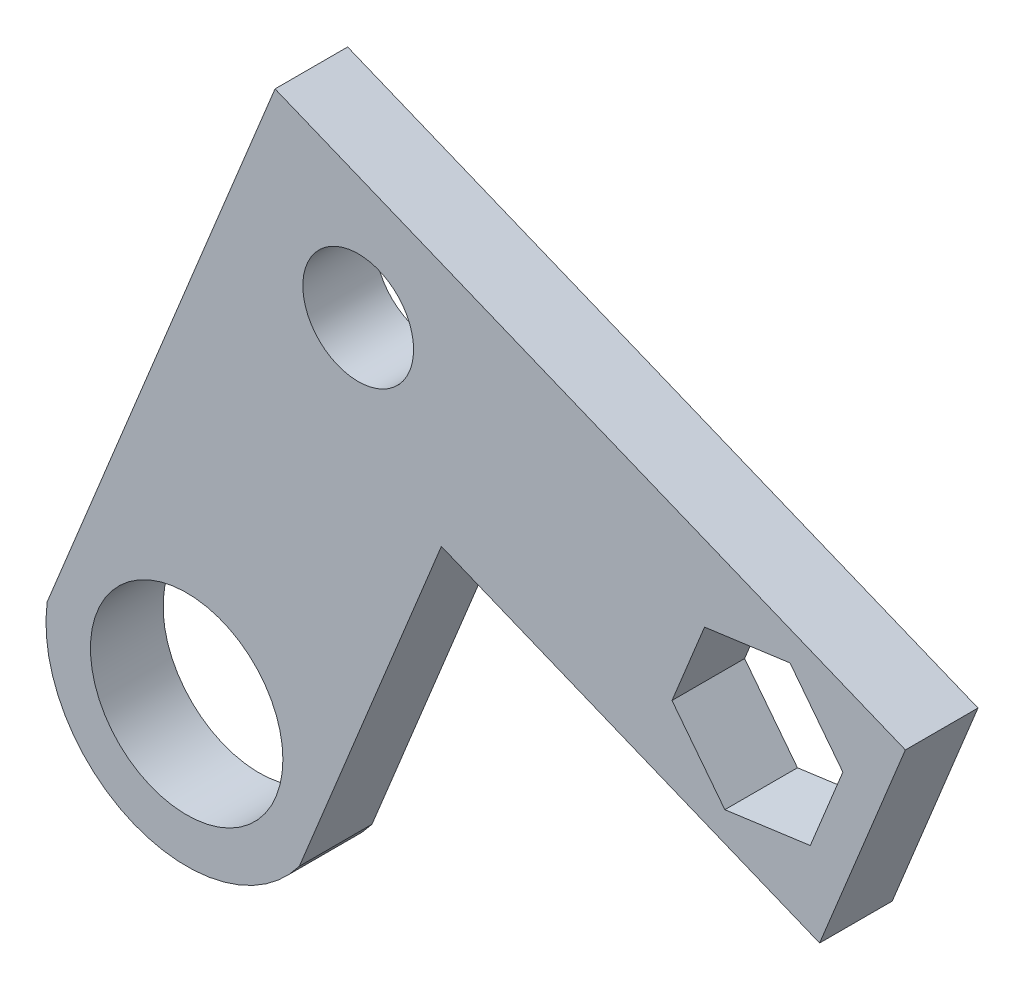
ISO-10303-21;
HEADER;
FILE_DESCRIPTION(('STEP AP214'),'2;1');
FILE_NAME('part.step','',(''),(''),'','','');
FILE_SCHEMA(('AUTOMOTIVE_DESIGN { 1 0 10303 214 1 1 1 1 }'));
ENDSEC;
DATA;
#1=APPLICATION_CONTEXT('core data for automotive mechanical design processes');
#2=APPLICATION_PROTOCOL_DEFINITION('international standard','automotive_design',2000,#1);
#3=PRODUCT_CONTEXT('',#1,'mechanical');
#4=PRODUCT('Part','Part','',(#3));
#5=PRODUCT_RELATED_PRODUCT_CATEGORY('part','',(#4));
#6=PRODUCT_DEFINITION_FORMATION('','',#4);
#7=PRODUCT_DEFINITION_CONTEXT('part definition',#1,'design');
#8=PRODUCT_DEFINITION('design','',#6,#7);
#9=PRODUCT_DEFINITION_SHAPE('','',#8);
#10=(LENGTH_UNIT() NAMED_UNIT(*) SI_UNIT(.MILLI.,.METRE.));
#11=(NAMED_UNIT(*) PLANE_ANGLE_UNIT() SI_UNIT($,.RADIAN.));
#12=(NAMED_UNIT(*) SI_UNIT($,.STERADIAN.) SOLID_ANGLE_UNIT());
#13=UNCERTAINTY_MEASURE_WITH_UNIT(LENGTH_MEASURE(1.E-05),#10,'distance_accuracy_value','');
#14=(GEOMETRIC_REPRESENTATION_CONTEXT(3) GLOBAL_UNCERTAINTY_ASSIGNED_CONTEXT((#13)) GLOBAL_UNIT_ASSIGNED_CONTEXT((#10,
#11,#12)) REPRESENTATION_CONTEXT('',''));
#15=CARTESIAN_POINT('',(0.,0.,0.));
#16=DIRECTION('',(0.,0.,1.));
#17=DIRECTION('',(1.,0.,0.));
#18=AXIS2_PLACEMENT_3D('',#15,#16,#17);
#19=CARTESIAN_POINT('',(-67.7805192720799,-46.4934408049665,-8.));
#20=DIRECTION('',(-0.925838313972113,0.377919854441752,0.));
#21=DIRECTION('',(-0.377919854441752,-0.925838313972113,0.));
#22=AXIS2_PLACEMENT_3D('',#19,#20,#21);
#23=PLANE('',#22);
#24=DIRECTION('',(-0.377919854441752,-0.925838313972113,0.));
#25=VECTOR('',#24,1.);
#26=CARTESIAN_POINT('',(-67.7805192720799,-46.4934408049665,0.));
#27=LINE('',#26,#25);
#28=CARTESIAN_POINT('',(-42.6847041591342,14.9869680141119,0.));
#29=VERTEX_POINT('',#28);
#30=CARTESIAN_POINT('',(-67.7805192720799,-46.4934408049665,0.));
#31=VERTEX_POINT('',#30);
#32=EDGE_CURVE('E184',#29,#31,#27,.T.);
#33=ORIENTED_EDGE('',*,*,#32,.F.);
#34=DIRECTION('',(0.,0.,1.));
#35=VECTOR('',#34,1.);
#36=CARTESIAN_POINT('',(-42.6847041591342,14.9869680141119,-8.));
#37=LINE('',#36,#35);
#38=CARTESIAN_POINT('',(-42.6847041591342,14.9869680141119,-8.));
#39=VERTEX_POINT('',#38);
#40=EDGE_CURVE('E11',#39,#29,#37,.T.);
#41=ORIENTED_EDGE('',*,*,#40,.F.);
#42=DIRECTION('',(-0.377919854441752,-0.925838313972113,0.));
#43=VECTOR('',#42,1.);
#44=CARTESIAN_POINT('',(-67.7805192720799,-46.4934408049665,-8.));
#45=LINE('',#44,#43);
#46=CARTESIAN_POINT('',(-67.7805192720799,-46.4934408049665,-8.));
#47=VERTEX_POINT('',#46);
#48=EDGE_CURVE('E187',#39,#47,#45,.T.);
#49=ORIENTED_EDGE('',*,*,#48,.T.);
#50=DIRECTION('',(0.,0.,1.));
#51=VECTOR('',#50,1.);
#52=CARTESIAN_POINT('',(-67.7805192720799,-46.4934408049665,-8.));
#53=LINE('',#52,#51);
#54=EDGE_CURVE('E36',#47,#31,#53,.T.);
#55=ORIENTED_EDGE('',*,*,#54,.T.);
#56=EDGE_LOOP('',(#33,#41,#49,#55));
#57=FACE_BOUND('',#56,.T.);
#58=ADVANCED_FACE('F33',(#57),#23,.T.);
#59=CARTESIAN_POINT('',(-42.6847041591342,14.9869680141119,-8.));
#60=DIRECTION('',(0.377919854441752,0.925838313972113,0.));
#61=DIRECTION('',(-0.925838313972113,0.377919854441752,0.));
#62=AXIS2_PLACEMENT_3D('',#59,#60,#61);
#63=PLANE('',#62);
#64=DIRECTION('',(-0.925838313972113,0.377919854441752,0.));
#65=VECTOR('',#64,1.);
#66=CARTESIAN_POINT('',(-42.6847041591342,14.9869680141119,0.));
#67=LINE('',#66,#65);
#68=CARTESIAN_POINT('',(26.7531693887742,-13.3570210690196,0.));
#69=VERTEX_POINT('',#68);
#70=EDGE_CURVE('E191',#69,#29,#67,.T.);
#71=ORIENTED_EDGE('',*,*,#70,.F.);
#72=DIRECTION('',(0.,0.,1.));
#73=VECTOR('',#72,1.);
#74=CARTESIAN_POINT('',(26.7531693887742,-13.3570210690196,-8.));
#75=LINE('',#74,#73);
#76=CARTESIAN_POINT('',(26.7531693887742,-13.3570210690196,-8.));
#77=VERTEX_POINT('',#76);
#78=EDGE_CURVE('E41',#77,#69,#75,.T.);
#79=ORIENTED_EDGE('',*,*,#78,.F.);
#80=DIRECTION('',(-0.925838313972113,0.377919854441752,0.));
#81=VECTOR('',#80,1.);
#82=CARTESIAN_POINT('',(-42.6847041591342,14.9869680141119,-8.));
#83=LINE('',#82,#81);
#84=EDGE_CURVE('E203',#77,#39,#83,.T.);
#85=ORIENTED_EDGE('',*,*,#84,.T.);
#86=ORIENTED_EDGE('',*,*,#40,.T.);
#87=EDGE_LOOP('',(#71,#79,#85,#86));
#88=FACE_BOUND('',#87,.T.);
#89=ADVANCED_FACE('F240',(#88),#63,.T.);
#90=CARTESIAN_POINT('',(26.7531693887742,-13.3570210690196,-8.));
#91=DIRECTION('',(0.925838313972113,-0.377919854441753,0.));
#92=DIRECTION('',(0.377919854441753,0.925838313972113,0.));
#93=AXIS2_PLACEMENT_3D('',#90,#91,#92);
#94=PLANE('',#93);
#95=DIRECTION('',(0.377919854441753,0.925838313972113,0.));
#96=VECTOR('',#95,1.);
#97=CARTESIAN_POINT('',(26.7531693887742,-13.3570210690196,0.));
#98=LINE('',#97,#96);
#99=CARTESIAN_POINT('',(17.3051730277304,-36.5029789183224,0.));
#100=VERTEX_POINT('',#99);
#101=EDGE_CURVE('E217',#100,#69,#98,.T.);
#102=ORIENTED_EDGE('',*,*,#101,.F.);
#103=DIRECTION('',(0.,0.,1.));
#104=VECTOR('',#103,1.);
#105=CARTESIAN_POINT('',(17.3051730277304,-36.5029789183224,-8.));
#106=LINE('',#105,#104);
#107=CARTESIAN_POINT('',(17.3051730277304,-36.5029789183224,-8.));
#108=VERTEX_POINT('',#107);
#109=EDGE_CURVE('E223',#108,#100,#106,.T.);
#110=ORIENTED_EDGE('',*,*,#109,.F.);
#111=DIRECTION('',(0.377919854441753,0.925838313972113,0.));
#112=VECTOR('',#111,1.);
#113=CARTESIAN_POINT('',(26.7531693887742,-13.3570210690196,-8.));
#114=LINE('',#113,#112);
#115=EDGE_CURVE('E200',#108,#77,#114,.T.);
#116=ORIENTED_EDGE('',*,*,#115,.T.);
#117=ORIENTED_EDGE('',*,*,#78,.T.);
#118=EDGE_LOOP('',(#102,#110,#116,#117));
#119=FACE_BOUND('',#118,.T.);
#120=ADVANCED_FACE('F252',(#119),#94,.T.);
#121=CARTESIAN_POINT('',(17.3051730277304,-36.5029789183224,-8.));
#122=DIRECTION('',(-0.377919854441752,-0.925838313972113,0.));
#123=DIRECTION('',(0.925838313972113,-0.377919854441752,0.));
#124=AXIS2_PLACEMENT_3D('',#121,#122,#123);
#125=PLANE('',#124);
#126=DIRECTION('',(0.925838313972113,-0.377919854441751,0.));
#127=VECTOR('',#126,1.);
#128=CARTESIAN_POINT('',(17.3051730277304,-36.5029789183224,0.));
#129=LINE('',#128,#127);
#130=CARTESIAN_POINT('',(-24.3575511010147,-19.4965854684436,0.));
#131=VERTEX_POINT('',#130);
#132=EDGE_CURVE('E214',#131,#100,#129,.T.);
#133=ORIENTED_EDGE('',*,*,#132,.F.);
#134=DIRECTION('',(0.,0.,1.));
#135=VECTOR('',#134,1.);
#136=CARTESIAN_POINT('',(-24.3575511010147,-19.4965854684436,-8.));
#137=LINE('',#136,#135);
#138=CARTESIAN_POINT('',(-24.3575511010147,-19.4965854684436,-8.));
#139=VERTEX_POINT('',#138);
#140=EDGE_CURVE('E225',#139,#131,#137,.T.);
#141=ORIENTED_EDGE('',*,*,#140,.F.);
#142=DIRECTION('',(0.925838313972113,-0.377919854441751,0.));
#143=VECTOR('',#142,1.);
#144=CARTESIAN_POINT('',(17.3051730277304,-36.5029789183224,-8.));
#145=LINE('',#144,#143);
#146=EDGE_CURVE('E197',#139,#108,#145,.T.);
#147=ORIENTED_EDGE('',*,*,#146,.T.);
#148=ORIENTED_EDGE('',*,*,#109,.T.);
#149=EDGE_LOOP('',(#133,#141,#147,#148));
#150=FACE_BOUND('',#149,.T.);
#151=ADVANCED_FACE('F250',(#150),#125,.T.);
#152=CARTESIAN_POINT('',(-24.3575511010147,-19.4965854684436,-8.));
#153=DIRECTION('',(0.925838313972113,-0.377919854441751,0.));
#154=DIRECTION('',(0.377919854441751,0.925838313972114,0.));
#155=AXIS2_PLACEMENT_3D('',#152,#153,#154);
#156=PLANE('',#155);
#157=DIRECTION('',(0.377919854441751,0.925838313972113,0.));
#158=VECTOR('',#157,1.);
#159=CARTESIAN_POINT('',(-24.3575511010147,-19.4965854684436,0.));
#160=LINE('',#159,#158);
#161=CARTESIAN_POINT('',(-40.0053698529165,-57.8310364382191,0.));
#162=VERTEX_POINT('',#161);
#163=EDGE_CURVE('E211',#162,#131,#160,.T.);
#164=ORIENTED_EDGE('',*,*,#163,.F.);
#165=DIRECTION('',(0.,0.,1.));
#166=VECTOR('',#165,1.);
#167=CARTESIAN_POINT('',(-40.0053698529165,-57.8310364382191,-8.));
#168=LINE('',#167,#166);
#169=CARTESIAN_POINT('',(-40.0053698529165,-57.8310364382191,-8.));
#170=VERTEX_POINT('',#169);
#171=EDGE_CURVE('E226',#170,#162,#168,.T.);
#172=ORIENTED_EDGE('',*,*,#171,.F.);
#173=DIRECTION('',(0.377919854441751,0.925838313972113,0.));
#174=VECTOR('',#173,1.);
#175=CARTESIAN_POINT('',(-24.3575511010147,-19.4965854684436,-8.));
#176=LINE('',#175,#174);
#177=EDGE_CURVE('E194',#170,#139,#176,.T.);
#178=ORIENTED_EDGE('',*,*,#177,.T.);
#179=ORIENTED_EDGE('',*,*,#140,.T.);
#180=EDGE_LOOP('',(#164,#172,#178,#179));
#181=FACE_BOUND('',#180,.T.);
#182=ADVANCED_FACE('F247',(#181),#156,.T.);
#183=CARTESIAN_POINT('',(-52.417120352162,-48.5467244257714,-8.));
#184=DIRECTION('',(0.,0.,1.));
#185=DIRECTION('',(1.,0.,0.));
#186=AXIS2_PLACEMENT_3D('',#183,#184,#185);
#187=CYLINDRICAL_SURFACE('',#186,15.5);
#188=CARTESIAN_POINT('',(-52.417120352162,-48.5467244257714,0.));
#189=DIRECTION('',(0.,0.,1.));
#190=DIRECTION('',(1.,0.,0.));
#191=AXIS2_PLACEMENT_3D('',#188,#189,#190);
#192=CIRCLE('',#191,15.5);
#193=EDGE_CURVE('E208',#31,#162,#192,.T.);
#194=ORIENTED_EDGE('',*,*,#193,.F.);
#195=ORIENTED_EDGE('',*,*,#54,.F.);
#196=CARTESIAN_POINT('',(-52.417120352162,-48.5467244257714,-8.));
#197=DIRECTION('',(0.,0.,1.));
#198=DIRECTION('',(1.,0.,0.));
#199=AXIS2_PLACEMENT_3D('',#196,#197,#198);
#200=CIRCLE('',#199,15.5);
#201=EDGE_CURVE('E190',#47,#170,#200,.T.);
#202=ORIENTED_EDGE('',*,*,#201,.T.);
#203=ORIENTED_EDGE('',*,*,#171,.T.);
#204=EDGE_LOOP('',(#194,#195,#202,#203));
#205=FACE_BOUND('',#204,.T.);
#206=ADVANCED_FACE('F234',(#205),#187,.T.);
#207=CARTESIAN_POINT('',(-52.417120352162,-48.5467244257714,-8.));
#208=DIRECTION('',(0.,0.,1.));
#209=DIRECTION('',(1.,0.,0.));
#210=AXIS2_PLACEMENT_3D('',#207,#208,#209);
#211=PLANE('',#210);
#212=DIRECTION('',(-0.377919854441753,-0.925838313972113,0.));
#213=VECTOR('',#212,1.);
#214=CARTESIAN_POINT('',(1.043977727883,-21.4944959563764,-8.));
#215=LINE('',#214,#213);
#216=CARTESIAN_POINT('',(4.63421634507965,-12.6990319736413,-8.));
#217=VERTEX_POINT('',#216);
#218=CARTESIAN_POINT('',(1.043977727883,-21.4944959563764,-8.));
#219=VERTEX_POINT('',#218);
#220=EDGE_CURVE('E130',#217,#219,#215,.T.);
#221=ORIENTED_EDGE('',*,*,#220,.T.);
#222=DIRECTION('',(0.612839572475928,-0.79020735152713,0.));
#223=VECTOR('',#222,1.);
#224=CARTESIAN_POINT('',(6.86595366640428,-29.0014657958841,-8.));
#225=LINE('',#224,#223);
#226=CARTESIAN_POINT('',(6.86595366640428,-29.0014657958841,-8.));
#227=VERTEX_POINT('',#226);
#228=EDGE_CURVE('E124',#219,#227,#225,.T.);
#229=ORIENTED_EDGE('',*,*,#228,.T.);
#230=DIRECTION('',(0.990759426917679,0.135630962444984,0.));
#231=VECTOR('',#230,1.);
#232=CARTESIAN_POINT('',(16.2781682221223,-27.7129716526568,-8.));
#233=LINE('',#232,#231);
#234=CARTESIAN_POINT('',(16.2781682221223,-27.7129716526568,-8.));
#235=VERTEX_POINT('',#234);
#236=EDGE_CURVE('E133',#227,#235,#233,.T.);
#237=ORIENTED_EDGE('',*,*,#236,.T.);
#238=DIRECTION('',(0.377919854441747,0.925838313972115,0.));
#239=VECTOR('',#238,1.);
#240=CARTESIAN_POINT('',(19.8684068393189,-18.9175076699217,-8.));
#241=LINE('',#240,#239);
#242=CARTESIAN_POINT('',(19.8684068393189,-18.9175076699217,-8.));
#243=VERTEX_POINT('',#242);
#244=EDGE_CURVE('E49',#235,#243,#241,.T.);
#245=ORIENTED_EDGE('',*,*,#244,.T.);
#246=DIRECTION('',(-0.612839572475928,0.79020735152713,0.));
#247=VECTOR('',#246,1.);
#248=CARTESIAN_POINT('',(14.0464309007976,-11.4105378304139,-8.));
#249=LINE('',#248,#247);
#250=CARTESIAN_POINT('',(14.0464309007976,-11.4105378304139,-8.));
#251=VERTEX_POINT('',#250);
#252=EDGE_CURVE('E148',#243,#251,#249,.T.);
#253=ORIENTED_EDGE('',*,*,#252,.T.);
#254=DIRECTION('',(-0.990759426917678,-0.13563096244499,0.));
#255=VECTOR('',#254,1.);
#256=CARTESIAN_POINT('',(4.63421634507965,-12.6990319736413,-8.));
#257=LINE('',#256,#255);
#258=EDGE_CURVE('E151',#251,#217,#257,.T.);
#259=ORIENTED_EDGE('',*,*,#258,.T.);
#260=EDGE_LOOP('',(#221,#229,#237,#245,#253,#259));
#261=FACE_BOUND('',#260,.T.);
#262=CARTESIAN_POINT('',(-52.417120352162,-48.5467244257714,-8.));
#263=DIRECTION('',(0.,0.,1.));
#264=DIRECTION('',(1.,0.,0.));
#265=AXIS2_PLACEMENT_3D('',#262,#263,#264);
#266=CIRCLE('',#265,10.6);
#267=CARTESIAN_POINT('',(-41.817120352162,-48.5467244257714,-8.));
#268=VERTEX_POINT('',#267);
#269=EDGE_CURVE('E175',#268,#268,#266,.T.);
#270=ORIENTED_EDGE('',*,*,#269,.T.);
#271=EDGE_LOOP('',(#270));
#272=FACE_BOUND('',#271,.T.);
#273=CARTESIAN_POINT('',(-33.5211276300744,-2.25480872716588,-8.));
#274=DIRECTION('',(0.,0.,1.));
#275=DIRECTION('',(1.,0.,0.));
#276=AXIS2_PLACEMENT_3D('',#273,#274,#275);
#277=CIRCLE('',#276,6.1);
#278=CARTESIAN_POINT('',(-27.4211276300744,-2.25480872716588,-8.));
#279=VERTEX_POINT('',#278);
#280=EDGE_CURVE('E181',#279,#279,#277,.T.);
#281=ORIENTED_EDGE('',*,*,#280,.T.);
#282=EDGE_LOOP('',(#281));
#283=FACE_BOUND('',#282,.T.);
#284=ORIENTED_EDGE('',*,*,#48,.F.);
#285=ORIENTED_EDGE('',*,*,#84,.F.);
#286=ORIENTED_EDGE('',*,*,#115,.F.);
#287=ORIENTED_EDGE('',*,*,#146,.F.);
#288=ORIENTED_EDGE('',*,*,#177,.F.);
#289=ORIENTED_EDGE('',*,*,#201,.F.);
#290=EDGE_LOOP('',(#284,#285,#286,#287,#288,#289));
#291=FACE_BOUND('',#290,.T.);
#292=ADVANCED_FACE('F137',(#261,#272,#283,#291),#211,.F.);
#293=CARTESIAN_POINT('',(-52.417120352162,-48.5467244257714,0.));
#294=DIRECTION('',(0.,0.,1.));
#295=DIRECTION('',(1.,0.,0.));
#296=AXIS2_PLACEMENT_3D('',#293,#294,#295);
#297=PLANE('',#296);
#298=DIRECTION('',(0.612839572475928,-0.79020735152713,0.));
#299=VECTOR('',#298,1.);
#300=CARTESIAN_POINT('',(6.86595366640428,-29.0014657958841,0.));
#301=LINE('',#300,#299);
#302=CARTESIAN_POINT('',(1.043977727883,-21.4944959563764,0.));
#303=VERTEX_POINT('',#302);
#304=CARTESIAN_POINT('',(6.86595366640429,-29.0014657958841,0.));
#305=VERTEX_POINT('',#304);
#306=EDGE_CURVE('E57',#303,#305,#301,.T.);
#307=ORIENTED_EDGE('',*,*,#306,.F.);
#308=DIRECTION('',(-0.377919854441753,-0.925838313972113,0.));
#309=VECTOR('',#308,1.);
#310=CARTESIAN_POINT('',(1.043977727883,-21.4944959563764,0.));
#311=LINE('',#310,#309);
#312=CARTESIAN_POINT('',(4.63421634507965,-12.6990319736413,0.));
#313=VERTEX_POINT('',#312);
#314=EDGE_CURVE('E141',#313,#303,#311,.T.);
#315=ORIENTED_EDGE('',*,*,#314,.F.);
#316=DIRECTION('',(-0.990759426917678,-0.13563096244499,0.));
#317=VECTOR('',#316,1.);
#318=CARTESIAN_POINT('',(4.63421634507965,-12.6990319736413,0.));
#319=LINE('',#318,#317);
#320=CARTESIAN_POINT('',(14.0464309007976,-11.4105378304139,0.));
#321=VERTEX_POINT('',#320);
#322=EDGE_CURVE('E144',#321,#313,#319,.T.);
#323=ORIENTED_EDGE('',*,*,#322,.F.);
#324=DIRECTION('',(-0.612839572475928,0.79020735152713,0.));
#325=VECTOR('',#324,1.);
#326=CARTESIAN_POINT('',(14.0464309007976,-11.4105378304139,0.));
#327=LINE('',#326,#325);
#328=CARTESIAN_POINT('',(19.8684068393189,-18.9175076699217,0.));
#329=VERTEX_POINT('',#328);
#330=EDGE_CURVE('E160',#329,#321,#327,.T.);
#331=ORIENTED_EDGE('',*,*,#330,.F.);
#332=DIRECTION('',(0.377919854441747,0.925838313972115,0.));
#333=VECTOR('',#332,1.);
#334=CARTESIAN_POINT('',(19.8684068393189,-18.9175076699217,0.));
#335=LINE('',#334,#333);
#336=CARTESIAN_POINT('',(16.2781682221223,-27.7129716526568,0.));
#337=VERTEX_POINT('',#336);
#338=EDGE_CURVE('E157',#337,#329,#335,.T.);
#339=ORIENTED_EDGE('',*,*,#338,.F.);
#340=DIRECTION('',(0.990759426917679,0.135630962444984,0.));
#341=VECTOR('',#340,1.);
#342=CARTESIAN_POINT('',(16.2781682221223,-27.7129716526568,0.));
#343=LINE('',#342,#341);
#344=EDGE_CURVE('E155',#305,#337,#343,.T.);
#345=ORIENTED_EDGE('',*,*,#344,.F.);
#346=EDGE_LOOP('',(#307,#315,#323,#331,#339,#345));
#347=FACE_BOUND('',#346,.T.);
#348=CARTESIAN_POINT('',(-52.417120352162,-48.5467244257714,0.));
#349=DIRECTION('',(0.,0.,1.));
#350=DIRECTION('',(1.,0.,0.));
#351=AXIS2_PLACEMENT_3D('',#348,#349,#350);
#352=CIRCLE('',#351,10.6);
#353=CARTESIAN_POINT('',(-41.817120352162,-48.5467244257714,0.));
#354=VERTEX_POINT('',#353);
#355=EDGE_CURVE('E167',#354,#354,#352,.T.);
#356=ORIENTED_EDGE('',*,*,#355,.F.);
#357=EDGE_LOOP('',(#356));
#358=FACE_BOUND('',#357,.T.);
#359=CARTESIAN_POINT('',(-33.5211276300744,-2.25480872716588,0.));
#360=DIRECTION('',(0.,0.,1.));
#361=DIRECTION('',(1.,0.,0.));
#362=AXIS2_PLACEMENT_3D('',#359,#360,#361);
#363=CIRCLE('',#362,6.1);
#364=CARTESIAN_POINT('',(-27.4211276300744,-2.25480872716588,0.));
#365=VERTEX_POINT('',#364);
#366=EDGE_CURVE('E178',#365,#365,#363,.T.);
#367=ORIENTED_EDGE('',*,*,#366,.F.);
#368=EDGE_LOOP('',(#367));
#369=FACE_BOUND('',#368,.T.);
#370=ORIENTED_EDGE('',*,*,#32,.T.);
#371=ORIENTED_EDGE('',*,*,#193,.T.);
#372=ORIENTED_EDGE('',*,*,#163,.T.);
#373=ORIENTED_EDGE('',*,*,#132,.T.);
#374=ORIENTED_EDGE('',*,*,#101,.T.);
#375=ORIENTED_EDGE('',*,*,#70,.T.);
#376=EDGE_LOOP('',(#370,#371,#372,#373,#374,#375));
#377=FACE_BOUND('',#376,.T.);
#378=ADVANCED_FACE('F236',(#347,#358,#369,#377),#297,.T.);
#379=CARTESIAN_POINT('',(-33.5211276300744,-2.25480872716588,-8.));
#380=DIRECTION('',(0.,0.,1.));
#381=DIRECTION('',(1.,0.,0.));
#382=AXIS2_PLACEMENT_3D('',#379,#380,#381);
#383=CYLINDRICAL_SURFACE('',#382,6.1);
#384=ORIENTED_EDGE('',*,*,#280,.F.);
#385=EDGE_LOOP('',(#384));
#386=FACE_BOUND('',#385,.T.);
#387=ORIENTED_EDGE('',*,*,#366,.T.);
#388=EDGE_LOOP('',(#387));
#389=FACE_BOUND('',#388,.T.);
#390=ADVANCED_FACE('F310',(#386,#389),#383,.F.);
#391=CARTESIAN_POINT('',(-52.417120352162,-48.5467244257714,-8.));
#392=DIRECTION('',(0.,0.,1.));
#393=DIRECTION('',(1.,0.,0.));
#394=AXIS2_PLACEMENT_3D('',#391,#392,#393);
#395=CYLINDRICAL_SURFACE('',#394,10.6);
#396=ORIENTED_EDGE('',*,*,#269,.F.);
#397=EDGE_LOOP('',(#396));
#398=FACE_BOUND('',#397,.T.);
#399=ORIENTED_EDGE('',*,*,#355,.T.);
#400=EDGE_LOOP('',(#399));
#401=FACE_BOUND('',#400,.T.);
#402=ADVANCED_FACE('F320',(#398,#401),#395,.F.);
#403=CARTESIAN_POINT('',(6.86595366640428,-29.0014657958841,-8.));
#404=DIRECTION('',(-0.79020735152713,-0.612839572475928,0.));
#405=DIRECTION('',(0.612839572475928,-0.79020735152713,0.));
#406=AXIS2_PLACEMENT_3D('',#403,#404,#405);
#407=PLANE('',#406);
#408=ORIENTED_EDGE('',*,*,#306,.T.);
#409=DIRECTION('',(0.,0.,1.));
#410=VECTOR('',#409,1.);
#411=CARTESIAN_POINT('',(6.86595366640428,-29.0014657958841,-8.));
#412=LINE('',#411,#410);
#413=EDGE_CURVE('E120',#227,#305,#412,.T.);
#414=ORIENTED_EDGE('',*,*,#413,.F.);
#415=ORIENTED_EDGE('',*,*,#228,.F.);
#416=DIRECTION('',(0.,0.,1.));
#417=VECTOR('',#416,1.);
#418=CARTESIAN_POINT('',(1.043977727883,-21.4944959563764,-8.));
#419=LINE('',#418,#417);
#420=EDGE_CURVE('E165',#219,#303,#419,.T.);
#421=ORIENTED_EDGE('',*,*,#420,.T.);
#422=EDGE_LOOP('',(#408,#414,#415,#421));
#423=FACE_BOUND('',#422,.T.);
#424=ADVANCED_FACE('F122',(#423),#407,.F.);
#425=CARTESIAN_POINT('',(1.043977727883,-21.4944959563764,-8.));
#426=DIRECTION('',(-0.925838313972113,0.377919854441753,0.));
#427=DIRECTION('',(-0.377919854441753,-0.925838313972113,0.));
#428=AXIS2_PLACEMENT_3D('',#425,#426,#427);
#429=PLANE('',#428);
#430=ORIENTED_EDGE('',*,*,#314,.T.);
#431=ORIENTED_EDGE('',*,*,#420,.F.);
#432=ORIENTED_EDGE('',*,*,#220,.F.);
#433=DIRECTION('',(0.,0.,1.));
#434=VECTOR('',#433,1.);
#435=CARTESIAN_POINT('',(4.63421634507965,-12.6990319736413,-8.));
#436=LINE('',#435,#434);
#437=EDGE_CURVE('E168',#217,#313,#436,.T.);
#438=ORIENTED_EDGE('',*,*,#437,.T.);
#439=EDGE_LOOP('',(#430,#431,#432,#438));
#440=FACE_BOUND('',#439,.T.);
#441=ADVANCED_FACE('F339',(#440),#429,.F.);
#442=CARTESIAN_POINT('',(4.63421634507965,-12.6990319736413,-8.));
#443=DIRECTION('',(-0.13563096244499,0.990759426917678,0.));
#444=DIRECTION('',(-0.990759426917678,-0.13563096244499,0.));
#445=AXIS2_PLACEMENT_3D('',#442,#443,#444);
#446=PLANE('',#445);
#447=ORIENTED_EDGE('',*,*,#322,.T.);
#448=ORIENTED_EDGE('',*,*,#437,.F.);
#449=ORIENTED_EDGE('',*,*,#258,.F.);
#450=DIRECTION('',(0.,0.,1.));
#451=VECTOR('',#450,1.);
#452=CARTESIAN_POINT('',(14.0464309007976,-11.4105378304139,-8.));
#453=LINE('',#452,#451);
#454=EDGE_CURVE('E170',#251,#321,#453,.T.);
#455=ORIENTED_EDGE('',*,*,#454,.T.);
#456=EDGE_LOOP('',(#447,#448,#449,#455));
#457=FACE_BOUND('',#456,.T.);
#458=ADVANCED_FACE('F348',(#457),#446,.F.);
#459=CARTESIAN_POINT('',(14.0464309007976,-11.4105378304139,-8.));
#460=DIRECTION('',(0.79020735152713,0.612839572475928,0.));
#461=DIRECTION('',(-0.612839572475928,0.790207351527131,0.));
#462=AXIS2_PLACEMENT_3D('',#459,#460,#461);
#463=PLANE('',#462);
#464=ORIENTED_EDGE('',*,*,#330,.T.);
#465=ORIENTED_EDGE('',*,*,#454,.F.);
#466=ORIENTED_EDGE('',*,*,#252,.F.);
#467=DIRECTION('',(0.,0.,1.));
#468=VECTOR('',#467,1.);
#469=CARTESIAN_POINT('',(19.8684068393189,-18.9175076699217,-8.));
#470=LINE('',#469,#468);
#471=EDGE_CURVE('E172',#243,#329,#470,.T.);
#472=ORIENTED_EDGE('',*,*,#471,.T.);
#473=EDGE_LOOP('',(#464,#465,#466,#472));
#474=FACE_BOUND('',#473,.T.);
#475=ADVANCED_FACE('F358',(#474),#463,.F.);
#476=CARTESIAN_POINT('',(19.8684068393189,-18.9175076699217,-8.));
#477=DIRECTION('',(0.925838313972115,-0.377919854441747,0.));
#478=DIRECTION('',(0.377919854441747,0.925838313972115,0.));
#479=AXIS2_PLACEMENT_3D('',#476,#477,#478);
#480=PLANE('',#479);
#481=ORIENTED_EDGE('',*,*,#338,.T.);
#482=ORIENTED_EDGE('',*,*,#471,.F.);
#483=ORIENTED_EDGE('',*,*,#244,.F.);
#484=DIRECTION('',(0.,0.,1.));
#485=VECTOR('',#484,1.);
#486=CARTESIAN_POINT('',(16.2781682221223,-27.7129716526568,-8.));
#487=LINE('',#486,#485);
#488=EDGE_CURVE('E129',#235,#337,#487,.T.);
#489=ORIENTED_EDGE('',*,*,#488,.T.);
#490=EDGE_LOOP('',(#481,#482,#483,#489));
#491=FACE_BOUND('',#490,.T.);
#492=ADVANCED_FACE('F368',(#491),#480,.F.);
#493=CARTESIAN_POINT('',(16.2781682221223,-27.7129716526568,-8.));
#494=DIRECTION('',(0.135630962444984,-0.990759426917679,0.));
#495=DIRECTION('',(0.990759426917679,0.135630962444984,0.));
#496=AXIS2_PLACEMENT_3D('',#493,#494,#495);
#497=PLANE('',#496);
#498=ORIENTED_EDGE('',*,*,#344,.T.);
#499=ORIENTED_EDGE('',*,*,#488,.F.);
#500=ORIENTED_EDGE('',*,*,#236,.F.);
#501=ORIENTED_EDGE('',*,*,#413,.T.);
#502=EDGE_LOOP('',(#498,#499,#500,#501));
#503=FACE_BOUND('',#502,.T.);
#504=ADVANCED_FACE('F134',(#503),#497,.F.);
#505=CLOSED_SHELL('',(#58,#89,#120,#151,#182,#206,#292,#378,#390,#402,#424,#441,#458,#475,#492,#504));
#506=MANIFOLD_SOLID_BREP('B2',#505);
#507=ADVANCED_BREP_SHAPE_REPRESENTATION('',(#18,#506),#14);
#508=SHAPE_DEFINITION_REPRESENTATION(#9,#507);
ENDSEC;
END-ISO-10303-21;
